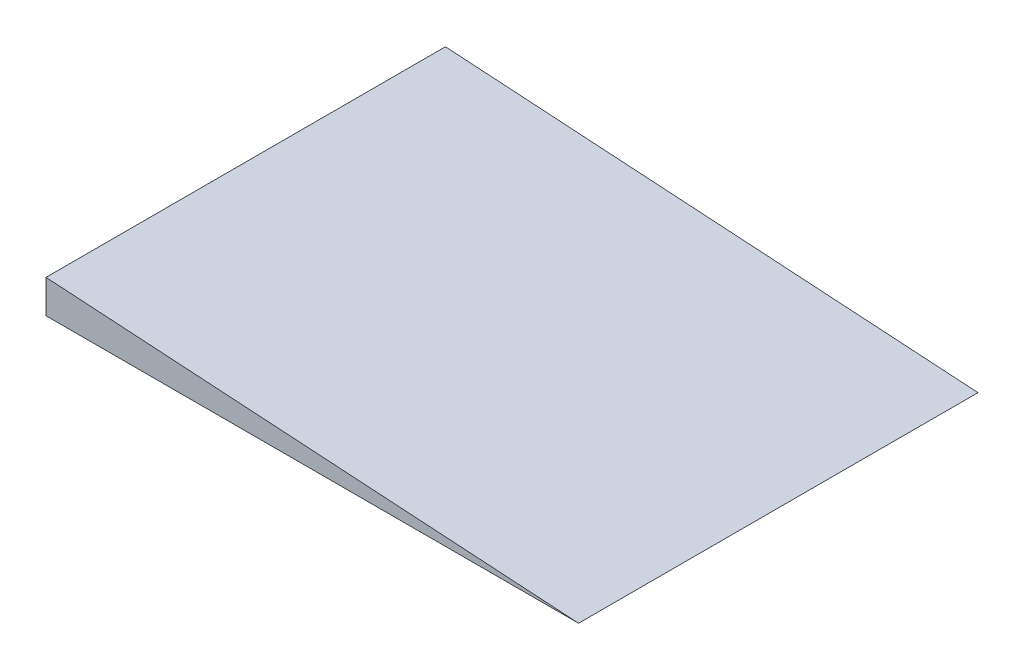
ISO-10303-21;
HEADER;
FILE_DESCRIPTION(('STEP AP214'),'2;1');
FILE_NAME('part.step','',(''),(''),'','','');
FILE_SCHEMA(('AUTOMOTIVE_DESIGN { 1 0 10303 214 1 1 1 1 }'));
ENDSEC;
DATA;
#1=APPLICATION_CONTEXT('core data for automotive mechanical design processes');
#2=APPLICATION_PROTOCOL_DEFINITION('international standard','automotive_design',2000,#1);
#3=PRODUCT_CONTEXT('',#1,'mechanical');
#4=PRODUCT('Part','Part','',(#3));
#5=PRODUCT_RELATED_PRODUCT_CATEGORY('part','',(#4));
#6=PRODUCT_DEFINITION_FORMATION('','',#4);
#7=PRODUCT_DEFINITION_CONTEXT('part definition',#1,'design');
#8=PRODUCT_DEFINITION('design','',#6,#7);
#9=PRODUCT_DEFINITION_SHAPE('','',#8);
#10=(LENGTH_UNIT() NAMED_UNIT(*) SI_UNIT(.MILLI.,.METRE.));
#11=(NAMED_UNIT(*) PLANE_ANGLE_UNIT() SI_UNIT($,.RADIAN.));
#12=(NAMED_UNIT(*) SI_UNIT($,.STERADIAN.) SOLID_ANGLE_UNIT());
#13=UNCERTAINTY_MEASURE_WITH_UNIT(LENGTH_MEASURE(1.E-05),#10,'distance_accuracy_value','');
#14=(GEOMETRIC_REPRESENTATION_CONTEXT(3) GLOBAL_UNCERTAINTY_ASSIGNED_CONTEXT((#13)) GLOBAL_UNIT_ASSIGNED_CONTEXT((#10,
#11,#12)) REPRESENTATION_CONTEXT('',''));
#15=CARTESIAN_POINT('',(0.,0.,0.));
#16=DIRECTION('',(0.,0.,1.));
#17=DIRECTION('',(1.,0.,0.));
#18=AXIS2_PLACEMENT_3D('',#15,#16,#17);
#19=CARTESIAN_POINT('',(0.,12.7,152.4));
#20=DIRECTION('',(1.,0.,0.));
#21=DIRECTION('',(0.,0.,-1.));
#22=AXIS2_PLACEMENT_3D('',#19,#20,#21);
#23=PLANE('',#22);
#24=DIRECTION('',(0.,-1.,0.));
#25=VECTOR('',#24,1.);
#26=CARTESIAN_POINT('',(0.,12.7,0.));
#27=LINE('',#26,#25);
#28=CARTESIAN_POINT('',(0.,12.7,0.));
#29=VERTEX_POINT('',#28);
#30=CARTESIAN_POINT('',(0.,0.,0.));
#31=VERTEX_POINT('',#30);
#32=EDGE_CURVE('E80',#29,#31,#27,.T.);
#33=ORIENTED_EDGE('',*,*,#32,.T.);
#34=DIRECTION('',(0.,0.,-1.));
#35=VECTOR('',#34,1.);
#36=CARTESIAN_POINT('',(0.,0.,152.4));
#37=LINE('',#36,#35);
#38=CARTESIAN_POINT('',(0.,0.,152.4));
#39=VERTEX_POINT('',#38);
#40=EDGE_CURVE('E11',#39,#31,#37,.T.);
#41=ORIENTED_EDGE('',*,*,#40,.F.);
#42=DIRECTION('',(0.,-1.,0.));
#43=VECTOR('',#42,1.);
#44=CARTESIAN_POINT('',(0.,12.7,152.4));
#45=LINE('',#44,#43);
#46=CARTESIAN_POINT('',(0.,12.7,152.4));
#47=VERTEX_POINT('',#46);
#48=EDGE_CURVE('E73',#47,#39,#45,.T.);
#49=ORIENTED_EDGE('',*,*,#48,.F.);
#50=DIRECTION('',(0.,0.,-1.));
#51=VECTOR('',#50,1.);
#52=CARTESIAN_POINT('',(0.,12.7,152.4));
#53=LINE('',#52,#51);
#54=EDGE_CURVE('E81',#47,#29,#53,.T.);
#55=ORIENTED_EDGE('',*,*,#54,.T.);
#56=EDGE_LOOP('',(#33,#41,#49,#55));
#57=FACE_BOUND('',#56,.T.);
#58=ADVANCED_FACE('F33',(#57),#23,.F.);
#59=CARTESIAN_POINT('',(0.,0.,152.4));
#60=DIRECTION('',(0.,1.,0.));
#61=DIRECTION('',(0.,0.,1.));
#62=AXIS2_PLACEMENT_3D('',#59,#60,#61);
#63=PLANE('',#62);
#64=DIRECTION('',(1.,0.,0.));
#65=VECTOR('',#64,1.);
#66=CARTESIAN_POINT('',(0.,0.,0.));
#67=LINE('',#66,#65);
#68=CARTESIAN_POINT('',(203.2,0.,0.));
#69=VERTEX_POINT('',#68);
#70=EDGE_CURVE('E61',#31,#69,#67,.T.);
#71=ORIENTED_EDGE('',*,*,#70,.T.);
#72=DIRECTION('',(0.,0.,-1.));
#73=VECTOR('',#72,1.);
#74=CARTESIAN_POINT('',(203.2,0.,152.4));
#75=LINE('',#74,#73);
#76=CARTESIAN_POINT('',(203.2,0.,152.4));
#77=VERTEX_POINT('',#76);
#78=EDGE_CURVE('E41',#77,#69,#75,.T.);
#79=ORIENTED_EDGE('',*,*,#78,.F.);
#80=DIRECTION('',(1.,0.,0.));
#81=VECTOR('',#80,1.);
#82=CARTESIAN_POINT('',(0.,0.,152.4));
#83=LINE('',#82,#81);
#84=EDGE_CURVE('E69',#39,#77,#83,.T.);
#85=ORIENTED_EDGE('',*,*,#84,.F.);
#86=ORIENTED_EDGE('',*,*,#40,.T.);
#87=EDGE_LOOP('',(#71,#79,#85,#86));
#88=FACE_BOUND('',#87,.T.);
#89=ADVANCED_FACE('F70',(#88),#63,.F.);
#90=CARTESIAN_POINT('',(203.2,0.,152.4));
#91=DIRECTION('',(-0.0623782861551805,-0.998052578482889,0.));
#92=DIRECTION('',(0.998052578482889,-0.0623782861551805,0.));
#93=AXIS2_PLACEMENT_3D('',#90,#91,#92);
#94=PLANE('',#93);
#95=DIRECTION('',(-0.998052578482889,0.0623782861551805,0.));
#96=VECTOR('',#95,1.);
#97=CARTESIAN_POINT('',(203.2,0.,0.));
#98=LINE('',#97,#96);
#99=EDGE_CURVE('E66',#69,#29,#98,.T.);
#100=ORIENTED_EDGE('',*,*,#99,.T.);
#101=ORIENTED_EDGE('',*,*,#54,.F.);
#102=DIRECTION('',(-0.998052578482889,0.0623782861551805,0.));
#103=VECTOR('',#102,1.);
#104=CARTESIAN_POINT('',(203.2,0.,152.4));
#105=LINE('',#104,#103);
#106=EDGE_CURVE('E49',#77,#47,#105,.T.);
#107=ORIENTED_EDGE('',*,*,#106,.F.);
#108=ORIENTED_EDGE('',*,*,#78,.T.);
#109=EDGE_LOOP('',(#100,#101,#107,#108));
#110=FACE_BOUND('',#109,.T.);
#111=ADVANCED_FACE('F88',(#110),#94,.F.);
#112=CARTESIAN_POINT('',(0.,0.,152.4));
#113=DIRECTION('',(0.,0.,1.));
#114=DIRECTION('',(1.,0.,0.));
#115=AXIS2_PLACEMENT_3D('',#112,#113,#114);
#116=PLANE('',#115);
#117=ORIENTED_EDGE('',*,*,#48,.T.);
#118=ORIENTED_EDGE('',*,*,#84,.T.);
#119=ORIENTED_EDGE('',*,*,#106,.T.);
#120=EDGE_LOOP('',(#117,#118,#119));
#121=FACE_BOUND('',#120,.T.);
#122=ADVANCED_FACE('F76',(#121),#116,.T.);
#123=CARTESIAN_POINT('',(0.,0.,0.));
#124=DIRECTION('',(0.,0.,1.));
#125=DIRECTION('',(1.,0.,0.));
#126=AXIS2_PLACEMENT_3D('',#123,#124,#125);
#127=PLANE('',#126);
#128=ORIENTED_EDGE('',*,*,#32,.F.);
#129=ORIENTED_EDGE('',*,*,#99,.F.);
#130=ORIENTED_EDGE('',*,*,#70,.F.);
#131=EDGE_LOOP('',(#128,#129,#130));
#132=FACE_BOUND('',#131,.T.);
#133=ADVANCED_FACE('F89',(#132),#127,.F.);
#134=CLOSED_SHELL('',(#58,#89,#111,#122,#133));
#135=MANIFOLD_SOLID_BREP('B2',#134);
#136=ADVANCED_BREP_SHAPE_REPRESENTATION('',(#18,#135),#14);
#137=SHAPE_DEFINITION_REPRESENTATION(#9,#136);
ENDSEC;
END-ISO-10303-21;
